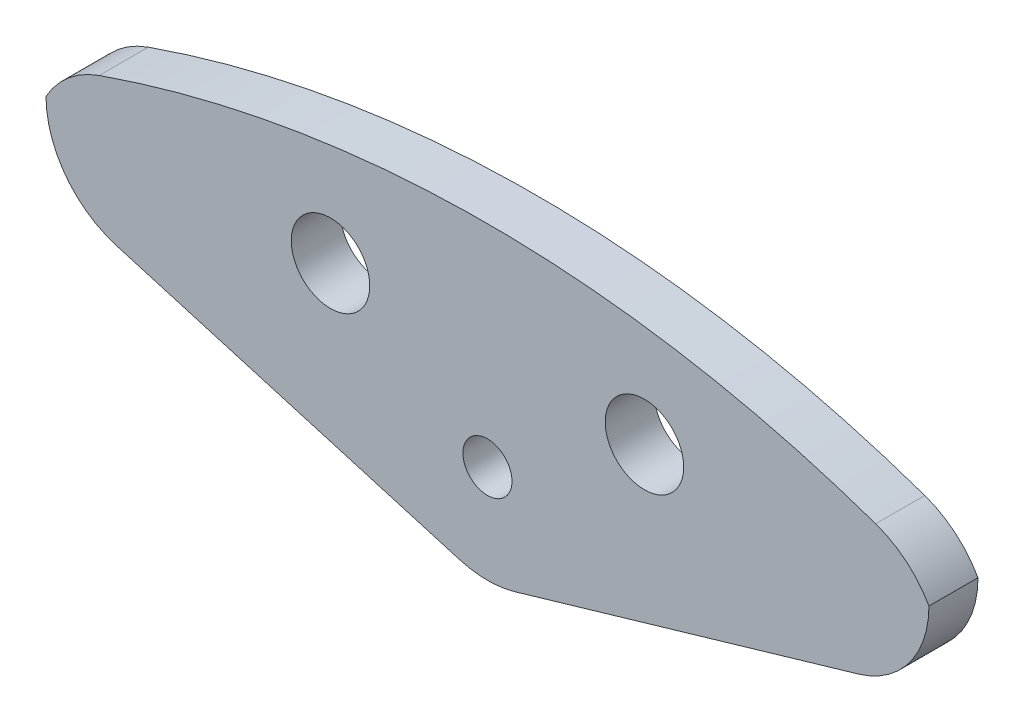
ISO-10303-21;
HEADER;
FILE_DESCRIPTION(('STEP AP214'),'2;1');
FILE_NAME('part.step','',(''),(''),'','','');
FILE_SCHEMA(('AUTOMOTIVE_DESIGN { 1 0 10303 214 1 1 1 1 }'));
ENDSEC;
DATA;
#1=APPLICATION_CONTEXT('core data for automotive mechanical design processes');
#2=APPLICATION_PROTOCOL_DEFINITION('international standard','automotive_design',2000,#1);
#3=PRODUCT_CONTEXT('',#1,'mechanical');
#4=PRODUCT('Part','Part','',(#3));
#5=PRODUCT_RELATED_PRODUCT_CATEGORY('part','',(#4));
#6=PRODUCT_DEFINITION_FORMATION('','',#4);
#7=PRODUCT_DEFINITION_CONTEXT('part definition',#1,'design');
#8=PRODUCT_DEFINITION('design','',#6,#7);
#9=PRODUCT_DEFINITION_SHAPE('','',#8);
#10=(LENGTH_UNIT() NAMED_UNIT(*) SI_UNIT(.MILLI.,.METRE.));
#11=(NAMED_UNIT(*) PLANE_ANGLE_UNIT() SI_UNIT($,.RADIAN.));
#12=(NAMED_UNIT(*) SI_UNIT($,.STERADIAN.) SOLID_ANGLE_UNIT());
#13=UNCERTAINTY_MEASURE_WITH_UNIT(LENGTH_MEASURE(1.E-05),#10,'distance_accuracy_value','');
#14=(GEOMETRIC_REPRESENTATION_CONTEXT(3) GLOBAL_UNCERTAINTY_ASSIGNED_CONTEXT((#13)) GLOBAL_UNIT_ASSIGNED_CONTEXT((#10,
#11,#12)) REPRESENTATION_CONTEXT('',''));
#15=CARTESIAN_POINT('',(0.,0.,0.));
#16=DIRECTION('',(0.,0.,1.));
#17=DIRECTION('',(1.,0.,0.));
#18=AXIS2_PLACEMENT_3D('',#15,#16,#17);
#19=CARTESIAN_POINT('',(0.,0.,5.));
#20=DIRECTION('',(0.,0.,1.));
#21=DIRECTION('',(1.,0.,0.));
#22=AXIS2_PLACEMENT_3D('',#19,#20,#21);
#23=PLANE('',#22);
#24=CARTESIAN_POINT('',(-16.,10.,5.));
#25=DIRECTION('',(0.,0.,1.));
#26=DIRECTION('',(1.,0.,0.));
#27=AXIS2_PLACEMENT_3D('',#24,#25,#26);
#28=CIRCLE('',#27,4.);
#29=CARTESIAN_POINT('',(-12.,10.,5.));
#30=VERTEX_POINT('',#29);
#31=EDGE_CURVE('E233',#30,#30,#28,.T.);
#32=ORIENTED_EDGE('',*,*,#31,.F.);
#33=EDGE_LOOP('',(#32));
#34=FACE_BOUND('',#33,.T.);
#35=CARTESIAN_POINT('',(35.,10.2370689589499,5.));
#36=DIRECTION('',(0.,0.,1.));
#37=DIRECTION('',(1.,0.,0.));
#38=AXIS2_PLACEMENT_3D('',#35,#36,#37);
#39=CIRCLE('',#38,10.);
#40=CARTESIAN_POINT('',(37.807261434753,0.639189857974024,5.));
#41=VERTEX_POINT('',#40);
#42=CARTESIAN_POINT('',(45.,10.2370689589499,5.));
#43=VERTEX_POINT('',#42);
#44=EDGE_CURVE('E138',#41,#43,#39,.T.);
#45=ORIENTED_EDGE('',*,*,#44,.T.);
#46=CARTESIAN_POINT('',(36.2779888191422,5.34559464531076,5.));
#47=DIRECTION('',(0.,0.,1.));
#48=DIRECTION('',(1.,0.,0.));
#49=AXIS2_PLACEMENT_3D('',#46,#47,#48);
#50=CIRCLE('',#49,10.);
#51=CARTESIAN_POINT('',(39.5759878027006,14.7861032494299,5.));
#52=VERTEX_POINT('',#51);
#53=EDGE_CURVE('E11',#43,#52,#50,.T.);
#54=ORIENTED_EDGE('',*,*,#53,.T.);
#55=CARTESIAN_POINT('',(0.,-98.5,5.));
#56=DIRECTION('',(0.,0.,1.));
#57=DIRECTION('',(-1.,0.,0.));
#58=AXIS2_PLACEMENT_3D('',#55,#56,#57);
#59=CIRCLE('',#58,120.);
#60=CARTESIAN_POINT('',(-39.5759878027005,14.7861032494299,5.));
#61=VERTEX_POINT('',#60);
#62=EDGE_CURVE('E107',#52,#61,#59,.T.);
#63=ORIENTED_EDGE('',*,*,#62,.T.);
#64=CARTESIAN_POINT('',(-36.2779888191422,5.34559464531078,5.));
#65=DIRECTION('',(0.,0.,1.));
#66=DIRECTION('',(1.,0.,0.));
#67=AXIS2_PLACEMENT_3D('',#64,#65,#66);
#68=CIRCLE('',#67,10.);
#69=CARTESIAN_POINT('',(-45.,10.2370689589499,5.));
#70=VERTEX_POINT('',#69);
#71=EDGE_CURVE('E41',#61,#70,#68,.T.);
#72=ORIENTED_EDGE('',*,*,#71,.T.);
#73=CARTESIAN_POINT('',(-35.,10.2370689589499,5.));
#74=DIRECTION('',(0.,0.,1.));
#75=DIRECTION('',(1.,0.,0.));
#76=AXIS2_PLACEMENT_3D('',#73,#74,#75);
#77=CIRCLE('',#76,10.);
#78=CARTESIAN_POINT('',(-37.8072614347529,0.63918985797402,5.));
#79=VERTEX_POINT('',#78);
#80=EDGE_CURVE('E140',#70,#79,#77,.T.);
#81=ORIENTED_EDGE('',*,*,#80,.T.);
#82=DIRECTION('',(0.959787910097584,-0.280726143475295,0.));
#83=VECTOR('',#82,1.);
#84=CARTESIAN_POINT('',(-45.,2.74297730643494,5.));
#85=LINE('',#84,#83);
#86=CARTESIAN_POINT('',(-2.80726143475295,-9.59787910097584,5.));
#87=VERTEX_POINT('',#86);
#88=EDGE_CURVE('E113',#79,#87,#85,.T.);
#89=ORIENTED_EDGE('',*,*,#88,.T.);
#90=CARTESIAN_POINT('',(0.,0.,5.));
#91=DIRECTION('',(0.,0.,1.));
#92=DIRECTION('',(1.,0.,0.));
#93=AXIS2_PLACEMENT_3D('',#90,#91,#92);
#94=CIRCLE('',#93,10.);
#95=CARTESIAN_POINT('',(2.80726143475295,-9.59787910097584,5.));
#96=VERTEX_POINT('',#95);
#97=EDGE_CURVE('E108',#87,#96,#94,.T.);
#98=ORIENTED_EDGE('',*,*,#97,.T.);
#99=DIRECTION('',(0.959787910097584,0.280726143475295,0.));
#100=VECTOR('',#99,1.);
#101=CARTESIAN_POINT('',(45.,2.74297730643494,5.));
#102=LINE('',#101,#100);
#103=EDGE_CURVE('E97',#96,#41,#102,.T.);
#104=ORIENTED_EDGE('',*,*,#103,.T.);
#105=EDGE_LOOP('',(#45,#54,#63,#72,#81,#89,#98,#104));
#106=FACE_BOUND('',#105,.T.);
#107=CARTESIAN_POINT('',(0.,0.,5.));
#108=DIRECTION('',(0.,0.,1.));
#109=DIRECTION('',(1.,0.,0.));
#110=AXIS2_PLACEMENT_3D('',#107,#108,#109);
#111=CIRCLE('',#110,2.5);
#112=CARTESIAN_POINT('',(2.5,0.,5.));
#113=VERTEX_POINT('',#112);
#114=EDGE_CURVE('E172',#113,#113,#111,.T.);
#115=ORIENTED_EDGE('',*,*,#114,.F.);
#116=EDGE_LOOP('',(#115));
#117=FACE_BOUND('',#116,.T.);
#118=CARTESIAN_POINT('',(16.,10.,5.));
#119=DIRECTION('',(0.,0.,1.));
#120=DIRECTION('',(1.,0.,0.));
#121=AXIS2_PLACEMENT_3D('',#118,#119,#120);
#122=CIRCLE('',#121,4.);
#123=CARTESIAN_POINT('',(20.,10.,5.));
#124=VERTEX_POINT('',#123);
#125=EDGE_CURVE('E224',#124,#124,#122,.T.);
#126=ORIENTED_EDGE('',*,*,#125,.F.);
#127=EDGE_LOOP('',(#126));
#128=FACE_BOUND('',#127,.T.);
#129=ADVANCED_FACE('F33',(#34,#106,#117,#128),#23,.T.);
#130=CARTESIAN_POINT('',(0.,0.,0.));
#131=DIRECTION('',(0.,0.,1.));
#132=DIRECTION('',(1.,0.,0.));
#133=AXIS2_PLACEMENT_3D('',#130,#131,#132);
#134=PLANE('',#133);
#135=CARTESIAN_POINT('',(0.,-98.5,0.));
#136=DIRECTION('',(0.,0.,1.));
#137=DIRECTION('',(-1.,0.,0.));
#138=AXIS2_PLACEMENT_3D('',#135,#136,#137);
#139=CIRCLE('',#138,120.);
#140=CARTESIAN_POINT('',(39.5759878027006,14.7861032494299,0.));
#141=VERTEX_POINT('',#140);
#142=CARTESIAN_POINT('',(-39.5759878027005,14.7861032494299,0.));
#143=VERTEX_POINT('',#142);
#144=EDGE_CURVE('E174',#141,#143,#139,.T.);
#145=ORIENTED_EDGE('',*,*,#144,.F.);
#146=CARTESIAN_POINT('',(36.2779888191422,5.34559464531076,0.));
#147=DIRECTION('',(0.,0.,1.));
#148=DIRECTION('',(1.,0.,0.));
#149=AXIS2_PLACEMENT_3D('',#146,#147,#148);
#150=CIRCLE('',#149,10.);
#151=CARTESIAN_POINT('',(45.,10.2370689589499,0.));
#152=VERTEX_POINT('',#151);
#153=EDGE_CURVE('E152',#141,#152,#150,.F.);
#154=ORIENTED_EDGE('',*,*,#153,.T.);
#155=CARTESIAN_POINT('',(35.,10.2370689589499,0.));
#156=DIRECTION('',(0.,0.,1.));
#157=DIRECTION('',(1.,0.,0.));
#158=AXIS2_PLACEMENT_3D('',#155,#156,#157);
#159=CIRCLE('',#158,10.);
#160=CARTESIAN_POINT('',(37.807261434753,0.639189857974024,0.));
#161=VERTEX_POINT('',#160);
#162=EDGE_CURVE('E126',#152,#161,#159,.F.);
#163=ORIENTED_EDGE('',*,*,#162,.T.);
#164=DIRECTION('',(0.959787910097584,0.280726143475295,0.));
#165=VECTOR('',#164,1.);
#166=CARTESIAN_POINT('',(45.,2.74297730643494,0.));
#167=LINE('',#166,#165);
#168=CARTESIAN_POINT('',(2.80726143475295,-9.59787910097584,0.));
#169=VERTEX_POINT('',#168);
#170=EDGE_CURVE('E171',#169,#161,#167,.T.);
#171=ORIENTED_EDGE('',*,*,#170,.F.);
#172=CARTESIAN_POINT('',(0.,0.,0.));
#173=DIRECTION('',(0.,0.,1.));
#174=DIRECTION('',(1.,0.,0.));
#175=AXIS2_PLACEMENT_3D('',#172,#173,#174);
#176=CIRCLE('',#175,10.);
#177=CARTESIAN_POINT('',(-2.80726143475295,-9.59787910097584,0.));
#178=VERTEX_POINT('',#177);
#179=EDGE_CURVE('E121',#178,#169,#176,.T.);
#180=ORIENTED_EDGE('',*,*,#179,.F.);
#181=DIRECTION('',(0.959787910097584,-0.280726143475295,0.));
#182=VECTOR('',#181,1.);
#183=CARTESIAN_POINT('',(-45.,2.74297730643494,0.));
#184=LINE('',#183,#182);
#185=CARTESIAN_POINT('',(-37.8072614347529,0.63918985797402,0.));
#186=VERTEX_POINT('',#185);
#187=EDGE_CURVE('E117',#186,#178,#184,.T.);
#188=ORIENTED_EDGE('',*,*,#187,.F.);
#189=CARTESIAN_POINT('',(-35.,10.2370689589499,0.));
#190=DIRECTION('',(0.,0.,1.));
#191=DIRECTION('',(1.,0.,0.));
#192=AXIS2_PLACEMENT_3D('',#189,#190,#191);
#193=CIRCLE('',#192,10.);
#194=CARTESIAN_POINT('',(-45.,10.2370689589499,0.));
#195=VERTEX_POINT('',#194);
#196=EDGE_CURVE('E132',#186,#195,#193,.F.);
#197=ORIENTED_EDGE('',*,*,#196,.T.);
#198=CARTESIAN_POINT('',(-36.2779888191422,5.34559464531078,0.));
#199=DIRECTION('',(0.,0.,1.));
#200=DIRECTION('',(1.,0.,0.));
#201=AXIS2_PLACEMENT_3D('',#198,#199,#200);
#202=CIRCLE('',#201,10.);
#203=EDGE_CURVE('E150',#195,#143,#202,.F.);
#204=ORIENTED_EDGE('',*,*,#203,.T.);
#205=EDGE_LOOP('',(#145,#154,#163,#171,#180,#188,#197,#204));
#206=FACE_BOUND('',#205,.T.);
#207=CARTESIAN_POINT('',(0.,0.,0.));
#208=DIRECTION('',(0.,0.,1.));
#209=DIRECTION('',(1.,0.,0.));
#210=AXIS2_PLACEMENT_3D('',#207,#208,#209);
#211=CIRCLE('',#210,2.5);
#212=CARTESIAN_POINT('',(2.5,0.,0.));
#213=VERTEX_POINT('',#212);
#214=EDGE_CURVE('E236',#213,#213,#211,.T.);
#215=ORIENTED_EDGE('',*,*,#214,.T.);
#216=EDGE_LOOP('',(#215));
#217=FACE_BOUND('',#216,.T.);
#218=CARTESIAN_POINT('',(-16.,10.,0.));
#219=DIRECTION('',(0.,0.,1.));
#220=DIRECTION('',(1.,0.,0.));
#221=AXIS2_PLACEMENT_3D('',#218,#219,#220);
#222=CIRCLE('',#221,4.);
#223=CARTESIAN_POINT('',(-12.,10.,0.));
#224=VERTEX_POINT('',#223);
#225=EDGE_CURVE('E230',#224,#224,#222,.T.);
#226=ORIENTED_EDGE('',*,*,#225,.T.);
#227=EDGE_LOOP('',(#226));
#228=FACE_BOUND('',#227,.T.);
#229=CARTESIAN_POINT('',(16.,10.,0.));
#230=DIRECTION('',(0.,0.,1.));
#231=DIRECTION('',(1.,0.,0.));
#232=AXIS2_PLACEMENT_3D('',#229,#230,#231);
#233=CIRCLE('',#232,4.);
#234=CARTESIAN_POINT('',(20.,10.,0.));
#235=VERTEX_POINT('',#234);
#236=EDGE_CURVE('E227',#235,#235,#233,.T.);
#237=ORIENTED_EDGE('',*,*,#236,.T.);
#238=EDGE_LOOP('',(#237));
#239=FACE_BOUND('',#238,.T.);
#240=ADVANCED_FACE('F163',(#206,#217,#228,#239),#134,.F.);
#241=CARTESIAN_POINT('',(0.,0.,5.));
#242=DIRECTION('',(0.,0.,-1.));
#243=DIRECTION('',(-1.,0.,0.));
#244=AXIS2_PLACEMENT_3D('',#241,#242,#243);
#245=CYLINDRICAL_SURFACE('',#244,10.);
#246=ORIENTED_EDGE('',*,*,#179,.T.);
#247=DIRECTION('',(0.,0.,-1.));
#248=VECTOR('',#247,1.);
#249=CARTESIAN_POINT('',(2.80726143475295,-9.59787910097584,5.));
#250=LINE('',#249,#248);
#251=EDGE_CURVE('E102',#96,#169,#250,.T.);
#252=ORIENTED_EDGE('',*,*,#251,.F.);
#253=ORIENTED_EDGE('',*,*,#97,.F.);
#254=DIRECTION('',(0.,0.,-1.));
#255=VECTOR('',#254,1.);
#256=CARTESIAN_POINT('',(-2.80726143475295,-9.59787910097584,5.));
#257=LINE('',#256,#255);
#258=EDGE_CURVE('E123',#87,#178,#257,.T.);
#259=ORIENTED_EDGE('',*,*,#258,.T.);
#260=EDGE_LOOP('',(#246,#252,#253,#259));
#261=FACE_BOUND('',#260,.T.);
#262=ADVANCED_FACE('F119',(#261),#245,.T.);
#263=CARTESIAN_POINT('',(45.,2.74297730643494,5.));
#264=DIRECTION('',(-0.280726143475295,0.959787910097584,0.));
#265=DIRECTION('',(-0.959787910097584,-0.280726143475295,0.));
#266=AXIS2_PLACEMENT_3D('',#263,#264,#265);
#267=PLANE('',#266);
#268=ORIENTED_EDGE('',*,*,#170,.T.);
#269=DIRECTION('',(0.,0.,-1.));
#270=VECTOR('',#269,1.);
#271=CARTESIAN_POINT('',(37.807261434753,0.639189857974024,5.));
#272=LINE('',#271,#270);
#273=EDGE_CURVE('E105',#161,#41,#272,.F.);
#274=ORIENTED_EDGE('',*,*,#273,.T.);
#275=ORIENTED_EDGE('',*,*,#103,.F.);
#276=ORIENTED_EDGE('',*,*,#251,.T.);
#277=EDGE_LOOP('',(#268,#274,#275,#276));
#278=FACE_BOUND('',#277,.T.);
#279=ADVANCED_FACE('F100',(#278),#267,.F.);
#280=CARTESIAN_POINT('',(0.,-98.5,5.));
#281=DIRECTION('',(0.,0.,-1.));
#282=DIRECTION('',(-1.,0.,0.));
#283=AXIS2_PLACEMENT_3D('',#280,#281,#282);
#284=CYLINDRICAL_SURFACE('',#283,120.);
#285=ORIENTED_EDGE('',*,*,#62,.F.);
#286=DIRECTION('',(0.,0.,-1.));
#287=VECTOR('',#286,1.);
#288=CARTESIAN_POINT('',(39.5759878027006,14.7861032494299,5.));
#289=LINE('',#288,#287);
#290=EDGE_CURVE('E147',#52,#141,#289,.T.);
#291=ORIENTED_EDGE('',*,*,#290,.T.);
#292=ORIENTED_EDGE('',*,*,#144,.T.);
#293=DIRECTION('',(0.,0.,-1.));
#294=VECTOR('',#293,1.);
#295=CARTESIAN_POINT('',(-39.5759878027005,14.78610324943,5.));
#296=LINE('',#295,#294);
#297=EDGE_CURVE('E48',#143,#61,#296,.F.);
#298=ORIENTED_EDGE('',*,*,#297,.T.);
#299=EDGE_LOOP('',(#285,#291,#292,#298));
#300=FACE_BOUND('',#299,.T.);
#301=ADVANCED_FACE('F175',(#300),#284,.T.);
#302=CARTESIAN_POINT('',(-45.,2.74297730643494,5.));
#303=DIRECTION('',(0.280726143475295,0.959787910097584,0.));
#304=DIRECTION('',(-0.959787910097584,0.280726143475295,0.));
#305=AXIS2_PLACEMENT_3D('',#302,#303,#304);
#306=PLANE('',#305);
#307=ORIENTED_EDGE('',*,*,#88,.F.);
#308=DIRECTION('',(0.,0.,-1.));
#309=VECTOR('',#308,1.);
#310=CARTESIAN_POINT('',(-37.8072614347529,0.63918985797402,5.));
#311=LINE('',#310,#309);
#312=EDGE_CURVE('E122',#79,#186,#311,.T.);
#313=ORIENTED_EDGE('',*,*,#312,.T.);
#314=ORIENTED_EDGE('',*,*,#187,.T.);
#315=ORIENTED_EDGE('',*,*,#258,.F.);
#316=EDGE_LOOP('',(#307,#313,#314,#315));
#317=FACE_BOUND('',#316,.T.);
#318=ADVANCED_FACE('F166',(#317),#306,.F.);
#319=CARTESIAN_POINT('',(0.,0.,5.));
#320=DIRECTION('',(0.,0.,-1.));
#321=DIRECTION('',(-1.,0.,0.));
#322=AXIS2_PLACEMENT_3D('',#319,#320,#321);
#323=CYLINDRICAL_SURFACE('',#322,2.5);
#324=ORIENTED_EDGE('',*,*,#114,.T.);
#325=EDGE_LOOP('',(#324));
#326=FACE_BOUND('',#325,.T.);
#327=ORIENTED_EDGE('',*,*,#214,.F.);
#328=EDGE_LOOP('',(#327));
#329=FACE_BOUND('',#328,.T.);
#330=ADVANCED_FACE('F198',(#326,#329),#323,.F.);
#331=CARTESIAN_POINT('',(-16.,10.,5.));
#332=DIRECTION('',(0.,0.,-1.));
#333=DIRECTION('',(-1.,0.,0.));
#334=AXIS2_PLACEMENT_3D('',#331,#332,#333);
#335=CYLINDRICAL_SURFACE('',#334,4.);
#336=ORIENTED_EDGE('',*,*,#31,.T.);
#337=EDGE_LOOP('',(#336));
#338=FACE_BOUND('',#337,.T.);
#339=ORIENTED_EDGE('',*,*,#225,.F.);
#340=EDGE_LOOP('',(#339));
#341=FACE_BOUND('',#340,.T.);
#342=ADVANCED_FACE('F214',(#338,#341),#335,.F.);
#343=CARTESIAN_POINT('',(16.,10.,5.));
#344=DIRECTION('',(0.,0.,-1.));
#345=DIRECTION('',(-1.,0.,0.));
#346=AXIS2_PLACEMENT_3D('',#343,#344,#345);
#347=CYLINDRICAL_SURFACE('',#346,4.);
#348=ORIENTED_EDGE('',*,*,#125,.T.);
#349=EDGE_LOOP('',(#348));
#350=FACE_BOUND('',#349,.T.);
#351=ORIENTED_EDGE('',*,*,#236,.F.);
#352=EDGE_LOOP('',(#351));
#353=FACE_BOUND('',#352,.T.);
#354=ADVANCED_FACE('F210',(#350,#353),#347,.F.);
#355=CARTESIAN_POINT('',(-35.,10.2370689589499,5.));
#356=DIRECTION('',(0.,0.,-1.));
#357=DIRECTION('',(-1.,0.,0.));
#358=AXIS2_PLACEMENT_3D('',#355,#356,#357);
#359=CYLINDRICAL_SURFACE('',#358,10.);
#360=ORIENTED_EDGE('',*,*,#80,.F.);
#361=DIRECTION('',(0.,0.,-1.));
#362=VECTOR('',#361,1.);
#363=CARTESIAN_POINT('',(-45.,10.2370689589499,5.));
#364=LINE('',#363,#362);
#365=EDGE_CURVE('E135',#195,#70,#364,.F.);
#366=ORIENTED_EDGE('',*,*,#365,.F.);
#367=ORIENTED_EDGE('',*,*,#196,.F.);
#368=ORIENTED_EDGE('',*,*,#312,.F.);
#369=EDGE_LOOP('',(#360,#366,#367,#368));
#370=FACE_BOUND('',#369,.T.);
#371=ADVANCED_FACE('F159',(#370),#359,.T.);
#372=CARTESIAN_POINT('',(35.,10.2370689589499,5.));
#373=DIRECTION('',(0.,0.,-1.));
#374=DIRECTION('',(-1.,0.,0.));
#375=AXIS2_PLACEMENT_3D('',#372,#373,#374);
#376=CYLINDRICAL_SURFACE('',#375,10.);
#377=ORIENTED_EDGE('',*,*,#44,.F.);
#378=ORIENTED_EDGE('',*,*,#273,.F.);
#379=ORIENTED_EDGE('',*,*,#162,.F.);
#380=DIRECTION('',(0.,0.,-1.));
#381=VECTOR('',#380,1.);
#382=CARTESIAN_POINT('',(45.,10.2370689589499,5.));
#383=LINE('',#382,#381);
#384=EDGE_CURVE('E142',#43,#152,#383,.T.);
#385=ORIENTED_EDGE('',*,*,#384,.F.);
#386=EDGE_LOOP('',(#377,#378,#379,#385));
#387=FACE_BOUND('',#386,.T.);
#388=ADVANCED_FACE('F181',(#387),#376,.T.);
#389=CARTESIAN_POINT('',(36.2779888191422,5.34559464531076,5.));
#390=DIRECTION('',(0.,0.,1.));
#391=DIRECTION('',(1.,0.,0.));
#392=AXIS2_PLACEMENT_3D('',#389,#390,#391);
#393=CYLINDRICAL_SURFACE('',#392,10.);
#394=ORIENTED_EDGE('',*,*,#53,.F.);
#395=ORIENTED_EDGE('',*,*,#384,.T.);
#396=ORIENTED_EDGE('',*,*,#153,.F.);
#397=ORIENTED_EDGE('',*,*,#290,.F.);
#398=EDGE_LOOP('',(#394,#395,#396,#397));
#399=FACE_BOUND('',#398,.T.);
#400=ADVANCED_FACE('F182',(#399),#393,.T.);
#401=CARTESIAN_POINT('',(-36.2779888191422,5.34559464531078,5.));
#402=DIRECTION('',(0.,0.,1.));
#403=DIRECTION('',(1.,0.,0.));
#404=AXIS2_PLACEMENT_3D('',#401,#402,#403);
#405=CYLINDRICAL_SURFACE('',#404,10.);
#406=ORIENTED_EDGE('',*,*,#71,.F.);
#407=ORIENTED_EDGE('',*,*,#297,.F.);
#408=ORIENTED_EDGE('',*,*,#203,.F.);
#409=ORIENTED_EDGE('',*,*,#365,.T.);
#410=EDGE_LOOP('',(#406,#407,#408,#409));
#411=FACE_BOUND('',#410,.T.);
#412=ADVANCED_FACE('F35',(#411),#405,.T.);
#413=CLOSED_SHELL('',(#129,#240,#262,#279,#301,#318,#330,#342,#354,#371,#388,#400,#412));
#414=MANIFOLD_SOLID_BREP('B2',#413);
#415=ADVANCED_BREP_SHAPE_REPRESENTATION('',(#18,#414),#14);
#416=SHAPE_DEFINITION_REPRESENTATION(#9,#415);
ENDSEC;
END-ISO-10303-21;
